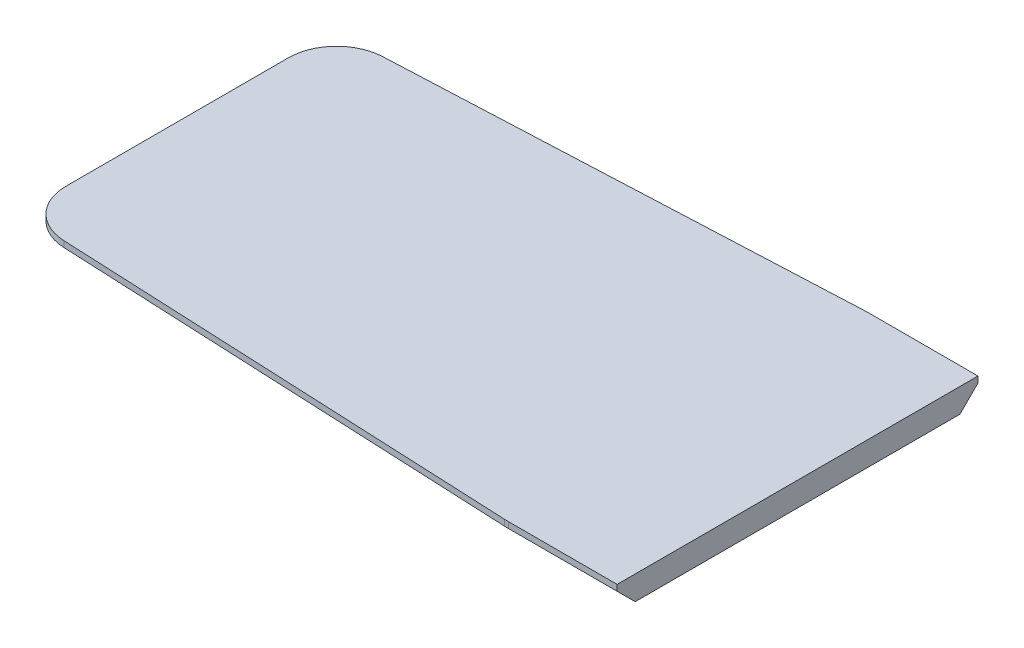
ISO-10303-21;
HEADER;
FILE_DESCRIPTION(('STEP AP214'),'2;1');
FILE_NAME('part.step','',(''),(''),'','','');
FILE_SCHEMA(('AUTOMOTIVE_DESIGN { 1 0 10303 214 1 1 1 1 }'));
ENDSEC;
DATA;
#1=APPLICATION_CONTEXT('core data for automotive mechanical design processes');
#2=APPLICATION_PROTOCOL_DEFINITION('international standard','automotive_design',2000,#1);
#3=PRODUCT_CONTEXT('',#1,'mechanical');
#4=PRODUCT('Part','Part','',(#3));
#5=PRODUCT_RELATED_PRODUCT_CATEGORY('part','',(#4));
#6=PRODUCT_DEFINITION_FORMATION('','',#4);
#7=PRODUCT_DEFINITION_CONTEXT('part definition',#1,'design');
#8=PRODUCT_DEFINITION('design','',#6,#7);
#9=PRODUCT_DEFINITION_SHAPE('','',#8);
#10=(LENGTH_UNIT() NAMED_UNIT(*) SI_UNIT(.MILLI.,.METRE.));
#11=(NAMED_UNIT(*) PLANE_ANGLE_UNIT() SI_UNIT($,.RADIAN.));
#12=(NAMED_UNIT(*) SI_UNIT($,.STERADIAN.) SOLID_ANGLE_UNIT());
#13=UNCERTAINTY_MEASURE_WITH_UNIT(LENGTH_MEASURE(1.E-05),#10,'distance_accuracy_value','');
#14=(GEOMETRIC_REPRESENTATION_CONTEXT(3) GLOBAL_UNCERTAINTY_ASSIGNED_CONTEXT((#13)) GLOBAL_UNIT_ASSIGNED_CONTEXT((#10,
#11,#12)) REPRESENTATION_CONTEXT('',''));
#15=CARTESIAN_POINT('',(0.,0.,0.));
#16=DIRECTION('',(0.,0.,1.));
#17=DIRECTION('',(1.,0.,0.));
#18=AXIS2_PLACEMENT_3D('',#15,#16,#17);
#19=CARTESIAN_POINT('',(45.6038073842628,20.2527928343975,0.));
#20=DIRECTION('',(1.,0.,0.));
#21=DIRECTION('',(0.,0.,-1.));
#22=AXIS2_PLACEMENT_3D('',#19,#20,#21);
#23=PLANE('',#22);
#24=DIRECTION('',(0.,1.,0.));
#25=VECTOR('',#24,1.);
#26=CARTESIAN_POINT('',(45.6038073842628,0.,19.05));
#27=LINE('',#26,#25);
#28=CARTESIAN_POINT('',(45.6038073842628,2.46375527922867,19.05));
#29=VERTEX_POINT('',#28);
#30=CARTESIAN_POINT('',(45.6038073842628,3.09875527922869,19.05));
#31=VERTEX_POINT('',#30);
#32=EDGE_CURVE('E232',#29,#31,#27,.T.);
#33=ORIENTED_EDGE('',*,*,#32,.F.);
#34=DIRECTION('',(0.,0.707106781186547,0.707106781186548));
#35=VECTOR('',#34,1.);
#36=CARTESIAN_POINT('',(45.6038073842628,2.46375527922867,19.05));
#37=LINE('',#36,#35);
#38=CARTESIAN_POINT('',(45.6038073842628,0.558755279228677,17.145));
#39=VERTEX_POINT('',#38);
#40=EDGE_CURVE('E206',#39,#29,#37,.T.);
#41=ORIENTED_EDGE('',*,*,#40,.F.);
#42=DIRECTION('',(0.,0.,-1.));
#43=VECTOR('',#42,1.);
#44=CARTESIAN_POINT('',(45.6038073842628,0.558755279228677,19.05));
#45=LINE('',#44,#43);
#46=CARTESIAN_POINT('',(45.6038073842628,0.558755279228677,-17.145));
#47=VERTEX_POINT('',#46);
#48=EDGE_CURVE('E233',#39,#47,#45,.T.);
#49=ORIENTED_EDGE('',*,*,#48,.T.);
#50=DIRECTION('',(0.,0.707106781186547,-0.707106781186548));
#51=VECTOR('',#50,1.);
#52=CARTESIAN_POINT('',(45.6038073842628,2.46375527922867,-19.05));
#53=LINE('',#52,#51);
#54=CARTESIAN_POINT('',(45.6038073842628,2.46375527922867,-19.05));
#55=VERTEX_POINT('',#54);
#56=EDGE_CURVE('E174',#47,#55,#53,.T.);
#57=ORIENTED_EDGE('',*,*,#56,.T.);
#58=DIRECTION('',(0.,1.,0.));
#59=VECTOR('',#58,1.);
#60=CARTESIAN_POINT('',(45.6038073842628,0.,-19.05));
#61=LINE('',#60,#59);
#62=CARTESIAN_POINT('',(45.6038073842628,3.09875527922869,-19.05));
#63=VERTEX_POINT('',#62);
#64=EDGE_CURVE('E171',#55,#63,#61,.T.);
#65=ORIENTED_EDGE('',*,*,#64,.T.);
#66=DIRECTION('',(0.,0.,1.));
#67=VECTOR('',#66,1.);
#68=CARTESIAN_POINT('',(45.6038073842628,3.09875527922869,0.));
#69=LINE('',#68,#67);
#70=EDGE_CURVE('E11',#63,#31,#69,.T.);
#71=ORIENTED_EDGE('',*,*,#70,.T.);
#72=EDGE_LOOP('',(#33,#41,#49,#57,#65,#71));
#73=FACE_BOUND('',#72,.T.);
#74=ADVANCED_FACE('F36',(#73),#23,.T.);
#75=CARTESIAN_POINT('',(45.6038073842628,3.09875527922869,0.));
#76=DIRECTION('',(0.,1.,0.));
#77=DIRECTION('',(-1.,0.,0.));
#78=AXIS2_PLACEMENT_3D('',#75,#76,#77);
#79=PLANE('',#78);
#80=DIRECTION('',(-1.,0.,0.));
#81=VECTOR('',#80,1.);
#82=CARTESIAN_POINT('',(0.,3.09875527922869,19.05));
#83=LINE('',#82,#81);
#84=CARTESIAN_POINT('',(34.1214030484803,3.09875527922869,19.05));
#85=VERTEX_POINT('',#84);
#86=EDGE_CURVE('E52',#31,#85,#83,.T.);
#87=ORIENTED_EDGE('',*,*,#86,.F.);
#88=ORIENTED_EDGE('',*,*,#70,.F.);
#89=DIRECTION('',(-1.,0.,0.));
#90=VECTOR('',#89,1.);
#91=CARTESIAN_POINT('',(0.,3.09875527922869,-19.05));
#92=LINE('',#91,#90);
#93=CARTESIAN_POINT('',(34.1214030484803,3.09875527922869,-19.05));
#94=VERTEX_POINT('',#93);
#95=EDGE_CURVE('E170',#63,#94,#92,.T.);
#96=ORIENTED_EDGE('',*,*,#95,.T.);
#97=CARTESIAN_POINT('',(34.1214030484803,3.09875527922869,-9.67692292797351));
#98=DIRECTION('',(0.,-1.,0.));
#99=DIRECTION('',(0.,0.,-1.));
#100=AXIS2_PLACEMENT_3D('',#97,#98,#99);
#101=CIRCLE('',#100,9.37307707202649);
#102=CARTESIAN_POINT('',(33.6957935430293,3.09875527922869,-19.0403320478944));
#103=VERTEX_POINT('',#102);
#104=EDGE_CURVE('E150',#103,#94,#101,.T.);
#105=ORIENTED_EDGE('',*,*,#104,.F.);
#106=DIRECTION('',(0.9989685402103,0.,-0.0454076609186504));
#107=VECTOR('',#106,1.);
#108=CARTESIAN_POINT('',(-29.6925031571086,3.09875527922869,-16.1590458342518));
#109=LINE('',#108,#107);
#110=CARTESIAN_POINT('',(-15.0460821307326,3.09875527922869,-16.8247922445416));
#111=VERTEX_POINT('',#110);
#112=EDGE_CURVE('E161',#111,#103,#109,.T.);
#113=ORIENTED_EDGE('',*,*,#112,.F.);
#114=CARTESIAN_POINT('',(-14.8154112132658,3.09875527922869,-11.7500320602733));
#115=DIRECTION('',(0.,1.,0.));
#116=DIRECTION('',(1.,0.,0.));
#117=AXIS2_PLACEMENT_3D('',#114,#115,#116);
#118=CIRCLE('',#117,5.08);
#119=CARTESIAN_POINT('',(-19.8954112132658,3.09875527922869,-11.7500320602733));
#120=VERTEX_POINT('',#119);
#121=EDGE_CURVE('E157',#111,#120,#118,.T.);
#122=ORIENTED_EDGE('',*,*,#121,.T.);
#123=DIRECTION('',(0.,0.,1.));
#124=VECTOR('',#123,1.);
#125=CARTESIAN_POINT('',(-19.8954112132658,3.09875527922868,29.972));
#126=LINE('',#125,#124);
#127=CARTESIAN_POINT('',(-19.8954112132658,3.09875527922869,11.7500320602733));
#128=VERTEX_POINT('',#127);
#129=EDGE_CURVE('E230',#120,#128,#126,.T.);
#130=ORIENTED_EDGE('',*,*,#129,.T.);
#131=CARTESIAN_POINT('',(-14.8154112132658,3.09875527922869,11.7500320602733));
#132=DIRECTION('',(0.,-1.,0.));
#133=DIRECTION('',(1.,0.,0.));
#134=AXIS2_PLACEMENT_3D('',#131,#132,#133);
#135=CIRCLE('',#134,5.08);
#136=CARTESIAN_POINT('',(-15.0460821307326,3.09875527922869,16.8247922445416));
#137=VERTEX_POINT('',#136);
#138=EDGE_CURVE('E60',#137,#128,#135,.T.);
#139=ORIENTED_EDGE('',*,*,#138,.F.);
#140=DIRECTION('',(0.9989685402103,0.,0.0454076609186504));
#141=VECTOR('',#140,1.);
#142=CARTESIAN_POINT('',(-29.6925031571086,3.09875527922869,16.1590458342518));
#143=LINE('',#142,#141);
#144=CARTESIAN_POINT('',(33.6957935430293,3.09875527922869,19.0403320478944));
#145=VERTEX_POINT('',#144);
#146=EDGE_CURVE('E236',#137,#145,#143,.T.);
#147=ORIENTED_EDGE('',*,*,#146,.T.);
#148=CARTESIAN_POINT('',(34.1214030484803,3.09875527922869,9.67692292797351));
#149=DIRECTION('',(0.,1.,0.));
#150=DIRECTION('',(0.,0.,1.));
#151=AXIS2_PLACEMENT_3D('',#148,#149,#150);
#152=CIRCLE('',#151,9.37307707202649);
#153=EDGE_CURVE('E234',#145,#85,#152,.T.);
#154=ORIENTED_EDGE('',*,*,#153,.T.);
#155=EDGE_LOOP('',(#87,#88,#96,#105,#113,#122,#130,#139,#147,#154));
#156=FACE_BOUND('',#155,.T.);
#157=ADVANCED_FACE('F168',(#156),#79,.T.);
#158=CARTESIAN_POINT('',(-17.9904112132658,0.558755279228695,19.05));
#159=DIRECTION('',(0.707106781186548,0.707106781186547,0.));
#160=DIRECTION('',(0.,0.,-1.));
#161=AXIS2_PLACEMENT_3D('',#158,#159,#160);
#162=PLANE('',#161);
#163=DIRECTION('',(0.,0.,1.));
#164=VECTOR('',#163,1.);
#165=CARTESIAN_POINT('',(-19.8954112132658,2.46375527922869,29.972));
#166=LINE('',#165,#164);
#167=CARTESIAN_POINT('',(-19.8954112132658,2.46375527922868,-11.7500320602733));
#168=VERTEX_POINT('',#167);
#169=CARTESIAN_POINT('',(-19.8954112132658,2.46375527922868,11.7500320602733));
#170=VERTEX_POINT('',#169);
#171=EDGE_CURVE('E211',#168,#170,#166,.T.);
#172=ORIENTED_EDGE('',*,*,#171,.F.);
#173=DIRECTION('',(0.707106781186547,-0.707106781186548,0.));
#174=VECTOR('',#173,1.);
#175=CARTESIAN_POINT('',(-19.8954112132658,2.46375527922869,-11.7500320602733));
#176=LINE('',#175,#174);
#177=CARTESIAN_POINT('',(-17.9904112132658,0.558755279228695,-11.7500320602733));
#178=VERTEX_POINT('',#177);
#179=EDGE_CURVE('E282',#168,#178,#176,.T.);
#180=ORIENTED_EDGE('',*,*,#179,.T.);
#181=DIRECTION('',(0.,0.,-1.));
#182=VECTOR('',#181,1.);
#183=CARTESIAN_POINT('',(-17.9904112132658,0.558755279228695,19.05));
#184=LINE('',#183,#182);
#185=CARTESIAN_POINT('',(-17.9904112132658,0.558755279228695,11.7500320602733));
#186=VERTEX_POINT('',#185);
#187=EDGE_CURVE('E213',#186,#178,#184,.T.);
#188=ORIENTED_EDGE('',*,*,#187,.F.);
#189=DIRECTION('',(0.707106781186547,-0.707106781186548,0.));
#190=VECTOR('',#189,1.);
#191=CARTESIAN_POINT('',(-19.8954112132658,2.46375527922869,11.7500320602733));
#192=LINE('',#191,#190);
#193=EDGE_CURVE('E192',#170,#186,#192,.T.);
#194=ORIENTED_EDGE('',*,*,#193,.F.);
#195=EDGE_LOOP('',(#172,#180,#188,#194));
#196=FACE_BOUND('',#195,.T.);
#197=ADVANCED_FACE('F280',(#196),#162,.F.);
#198=CARTESIAN_POINT('',(-29.6925031571086,2.46375527922868,16.1590458342518));
#199=DIRECTION('',(0.0321080649533972,0.707106781186548,-0.706377428974728));
#200=DIRECTION('',(0.9989685402103,0.,0.0454076609186504));
#201=AXIS2_PLACEMENT_3D('',#198,#199,#200);
#202=PLANE('',#201);
#203=DIRECTION('',(0.0321080649533972,-0.707106781186547,-0.706377428974729));
#204=VECTOR('',#203,1.);
#205=CARTESIAN_POINT('',(-15.0460821307326,2.46375527922868,16.8247922445416));
#206=LINE('',#205,#204);
#207=CARTESIAN_POINT('',(-15.0460821307326,2.46375527922868,16.8247922445416));
#208=VERTEX_POINT('',#207);
#209=CARTESIAN_POINT('',(-14.9595805366825,0.558755279228694,14.921757175441));
#210=VERTEX_POINT('',#209);
#211=EDGE_CURVE('E195',#208,#210,#206,.T.);
#212=ORIENTED_EDGE('',*,*,#211,.T.);
#213=DIRECTION('',(-0.9989685402103,0.,-0.0454076609186504));
#214=VECTOR('',#213,1.);
#215=CARTESIAN_POINT('',(0.156416003306425,0.55875527922869,15.6088479272587));
#216=LINE('',#215,#214);
#217=CARTESIAN_POINT('',(33.7822951370793,0.55875527922868,17.1372969787938));
#218=VERTEX_POINT('',#217);
#219=EDGE_CURVE('E220',#218,#210,#216,.T.);
#220=ORIENTED_EDGE('',*,*,#219,.F.);
#221=DIRECTION('',(0.0321080649533966,-0.707106781186546,-0.70637742897473));
#222=VECTOR('',#221,1.);
#223=CARTESIAN_POINT('',(33.6957935430293,2.46375527922867,19.0403320478944));
#224=LINE('',#223,#222);
#225=CARTESIAN_POINT('',(33.6957935430293,2.46375527922867,19.0403320478944));
#226=VERTEX_POINT('',#225);
#227=EDGE_CURVE('E198',#226,#218,#224,.T.);
#228=ORIENTED_EDGE('',*,*,#227,.F.);
#229=DIRECTION('',(0.9989685402103,0.,0.0454076609186504));
#230=VECTOR('',#229,1.);
#231=CARTESIAN_POINT('',(-29.6925031571086,2.46375527922868,16.1590458342518));
#232=LINE('',#231,#230);
#233=EDGE_CURVE('E203',#208,#226,#232,.T.);
#234=ORIENTED_EDGE('',*,*,#233,.F.);
#235=EDGE_LOOP('',(#212,#220,#228,#234));
#236=FACE_BOUND('',#235,.T.);
#237=ADVANCED_FACE('F269',(#236),#202,.F.);
#238=CARTESIAN_POINT('',(34.1214030484803,0.558755279228681,9.67692292797351));
#239=DIRECTION('',(0.,1.,0.));
#240=DIRECTION('',(0.,0.,1.));
#241=AXIS2_PLACEMENT_3D('',#238,#239,#240);
#242=CONICAL_SURFACE('',#241,7.4680770720265,0.785398163397448);
#243=ORIENTED_EDGE('',*,*,#227,.T.);
#244=CARTESIAN_POINT('',(34.1214030484803,0.55875527922868,9.67692292797351));
#245=DIRECTION('',(0.,1.,0.));
#246=DIRECTION('',(-1.,0.,0.));
#247=AXIS2_PLACEMENT_3D('',#244,#245,#246);
#248=CIRCLE('',#247,7.4680770720265);
#249=CARTESIAN_POINT('',(34.1214030484803,0.55875527922868,17.145));
#250=VERTEX_POINT('',#249);
#251=EDGE_CURVE('E218',#250,#218,#248,.F.);
#252=ORIENTED_EDGE('',*,*,#251,.F.);
#253=DIRECTION('',(0.,-0.707106781186548,-0.707106781186547));
#254=VECTOR('',#253,1.);
#255=CARTESIAN_POINT('',(34.1214030484803,2.46375527922867,19.05));
#256=LINE('',#255,#254);
#257=CARTESIAN_POINT('',(34.1214030484803,2.46375527922867,19.05));
#258=VERTEX_POINT('',#257);
#259=EDGE_CURVE('E45',#258,#250,#256,.T.);
#260=ORIENTED_EDGE('',*,*,#259,.F.);
#261=CARTESIAN_POINT('',(34.1214030484803,2.46375527922867,9.67692292797351));
#262=DIRECTION('',(0.,1.,0.));
#263=DIRECTION('',(0.,0.,1.));
#264=AXIS2_PLACEMENT_3D('',#261,#262,#263);
#265=CIRCLE('',#264,9.37307707202649);
#266=EDGE_CURVE('E205',#226,#258,#265,.T.);
#267=ORIENTED_EDGE('',*,*,#266,.F.);
#268=EDGE_LOOP('',(#243,#252,#260,#267));
#269=FACE_BOUND('',#268,.T.);
#270=ADVANCED_FACE('F262',(#269),#242,.T.);
#271=CARTESIAN_POINT('',(0.,0.,19.05));
#272=DIRECTION('',(0.,0.,1.));
#273=DIRECTION('',(1.,0.,0.));
#274=AXIS2_PLACEMENT_3D('',#271,#272,#273);
#275=PLANE('',#274);
#276=DIRECTION('',(1.,0.,0.));
#277=VECTOR('',#276,1.);
#278=CARTESIAN_POINT('',(48.1438073842628,2.46375527922867,19.05));
#279=LINE('',#278,#277);
#280=EDGE_CURVE('E208',#258,#29,#279,.T.);
#281=ORIENTED_EDGE('',*,*,#280,.T.);
#282=ORIENTED_EDGE('',*,*,#32,.T.);
#283=ORIENTED_EDGE('',*,*,#86,.T.);
#284=DIRECTION('',(0.,1.,0.));
#285=VECTOR('',#284,1.);
#286=CARTESIAN_POINT('',(34.1214030484803,-9.9706328408659,19.05));
#287=LINE('',#286,#285);
#288=EDGE_CURVE('E239',#258,#85,#287,.T.);
#289=ORIENTED_EDGE('',*,*,#288,.F.);
#290=EDGE_LOOP('',(#281,#282,#283,#289));
#291=FACE_BOUND('',#290,.T.);
#292=ADVANCED_FACE('F255',(#291),#275,.T.);
#293=CARTESIAN_POINT('',(0.,0.55875527922869,19.05));
#294=DIRECTION('',(0.,1.,0.));
#295=DIRECTION('',(-1.,0.,0.));
#296=AXIS2_PLACEMENT_3D('',#293,#294,#295);
#297=PLANE('',#296);
#298=ORIENTED_EDGE('',*,*,#48,.F.);
#299=DIRECTION('',(-1.,0.,0.));
#300=VECTOR('',#299,1.);
#301=CARTESIAN_POINT('',(34.1214030484803,0.55875527922868,17.145));
#302=LINE('',#301,#300);
#303=EDGE_CURVE('E217',#39,#250,#302,.T.);
#304=ORIENTED_EDGE('',*,*,#303,.T.);
#305=ORIENTED_EDGE('',*,*,#251,.T.);
#306=ORIENTED_EDGE('',*,*,#219,.T.);
#307=CARTESIAN_POINT('',(-14.8154112132658,0.558755279228694,11.7500320602733));
#308=DIRECTION('',(0.,1.,0.));
#309=DIRECTION('',(-1.,0.,0.));
#310=AXIS2_PLACEMENT_3D('',#307,#308,#309);
#311=CIRCLE('',#310,3.17500000000001);
#312=EDGE_CURVE('E215',#210,#186,#311,.F.);
#313=ORIENTED_EDGE('',*,*,#312,.T.);
#314=ORIENTED_EDGE('',*,*,#187,.T.);
#315=CARTESIAN_POINT('',(-14.8154112132658,0.558755279228694,-11.7500320602733));
#316=DIRECTION('',(0.,-1.,0.));
#317=DIRECTION('',(-1.,0.,0.));
#318=AXIS2_PLACEMENT_3D('',#315,#316,#317);
#319=CIRCLE('',#318,3.17500000000001);
#320=CARTESIAN_POINT('',(-14.9595805366825,0.558755279228694,-14.921757175441));
#321=VERTEX_POINT('',#320);
#322=EDGE_CURVE('E185',#321,#178,#319,.F.);
#323=ORIENTED_EDGE('',*,*,#322,.F.);
#324=DIRECTION('',(-0.9989685402103,0.,0.0454076609186504));
#325=VECTOR('',#324,1.);
#326=CARTESIAN_POINT('',(0.156416003306425,0.55875527922869,-15.6088479272587));
#327=LINE('',#326,#325);
#328=CARTESIAN_POINT('',(33.7822951370793,0.55875527922868,-17.1372969787938));
#329=VERTEX_POINT('',#328);
#330=EDGE_CURVE('E301',#329,#321,#327,.T.);
#331=ORIENTED_EDGE('',*,*,#330,.F.);
#332=CARTESIAN_POINT('',(34.1214030484803,0.55875527922868,-9.67692292797351));
#333=DIRECTION('',(0.,-1.,0.));
#334=DIRECTION('',(-1.,0.,0.));
#335=AXIS2_PLACEMENT_3D('',#332,#333,#334);
#336=CIRCLE('',#335,7.4680770720265);
#337=CARTESIAN_POINT('',(34.1214030484803,0.55875527922868,-17.145));
#338=VERTEX_POINT('',#337);
#339=EDGE_CURVE('E184',#338,#329,#336,.F.);
#340=ORIENTED_EDGE('',*,*,#339,.F.);
#341=DIRECTION('',(-1.,0.,0.));
#342=VECTOR('',#341,1.);
#343=CARTESIAN_POINT('',(34.1214030484803,0.55875527922868,-17.145));
#344=LINE('',#343,#342);
#345=EDGE_CURVE('E182',#47,#338,#344,.T.);
#346=ORIENTED_EDGE('',*,*,#345,.F.);
#347=EDGE_LOOP('',(#298,#304,#305,#306,#313,#314,#323,#331,#340,#346));
#348=FACE_BOUND('',#347,.T.);
#349=ADVANCED_FACE('F266',(#348),#297,.F.);
#350=CARTESIAN_POINT('',(0.,2.46375527922868,19.05));
#351=DIRECTION('',(0.,-0.707106781186548,0.707106781186547));
#352=DIRECTION('',(-1.,0.,0.));
#353=AXIS2_PLACEMENT_3D('',#350,#351,#352);
#354=PLANE('',#353);
#355=ORIENTED_EDGE('',*,*,#303,.F.);
#356=ORIENTED_EDGE('',*,*,#40,.T.);
#357=ORIENTED_EDGE('',*,*,#280,.F.);
#358=ORIENTED_EDGE('',*,*,#259,.T.);
#359=EDGE_LOOP('',(#355,#356,#357,#358));
#360=FACE_BOUND('',#359,.T.);
#361=ADVANCED_FACE('F38',(#360),#354,.T.);
#362=CARTESIAN_POINT('',(-29.6925031571086,28.6087552792287,16.1590458342518));
#363=DIRECTION('',(0.0454076609186504,0.,-0.9989685402103));
#364=DIRECTION('',(-0.9989685402103,0.,-0.0454076609186504));
#365=AXIS2_PLACEMENT_3D('',#362,#363,#364);
#366=PLANE('',#365);
#367=DIRECTION('',(0.,-1.,0.));
#368=VECTOR('',#367,1.);
#369=CARTESIAN_POINT('',(-15.0460821307325,28.6087552792287,16.8247922445416));
#370=LINE('',#369,#368);
#371=EDGE_CURVE('E225',#137,#208,#370,.T.);
#372=ORIENTED_EDGE('',*,*,#371,.T.);
#373=ORIENTED_EDGE('',*,*,#233,.T.);
#374=DIRECTION('',(0.,1.,0.));
#375=VECTOR('',#374,1.);
#376=CARTESIAN_POINT('',(33.6957935430293,-9.9706328408659,19.0403320478944));
#377=LINE('',#376,#375);
#378=EDGE_CURVE('E229',#226,#145,#377,.T.);
#379=ORIENTED_EDGE('',*,*,#378,.T.);
#380=ORIENTED_EDGE('',*,*,#146,.F.);
#381=EDGE_LOOP('',(#372,#373,#379,#380));
#382=FACE_BOUND('',#381,.T.);
#383=ADVANCED_FACE('F347',(#382),#366,.F.);
#384=CARTESIAN_POINT('',(-14.8154112132658,0.558755279228693,11.7500320602733));
#385=DIRECTION('',(0.,1.,0.));
#386=DIRECTION('',(0.,0.,1.));
#387=AXIS2_PLACEMENT_3D('',#384,#385,#386);
#388=CONICAL_SURFACE('',#387,3.17500000000001,0.785398163397449);
#389=ORIENTED_EDGE('',*,*,#193,.T.);
#390=ORIENTED_EDGE('',*,*,#312,.F.);
#391=ORIENTED_EDGE('',*,*,#211,.F.);
#392=CARTESIAN_POINT('',(-14.8154112132658,2.46375527922868,11.7500320602733));
#393=DIRECTION('',(0.,1.,0.));
#394=DIRECTION('',(0.,0.,1.));
#395=AXIS2_PLACEMENT_3D('',#392,#393,#394);
#396=CIRCLE('',#395,5.08);
#397=EDGE_CURVE('E209',#170,#208,#396,.T.);
#398=ORIENTED_EDGE('',*,*,#397,.F.);
#399=EDGE_LOOP('',(#389,#390,#391,#398));
#400=FACE_BOUND('',#399,.T.);
#401=ADVANCED_FACE('F274',(#400),#388,.T.);
#402=CARTESIAN_POINT('',(-19.8954112132658,26.6529253978415,29.972));
#403=DIRECTION('',(1.,0.,0.));
#404=DIRECTION('',(0.,1.,0.));
#405=AXIS2_PLACEMENT_3D('',#402,#403,#404);
#406=PLANE('',#405);
#407=ORIENTED_EDGE('',*,*,#129,.F.);
#408=DIRECTION('',(0.,-1.,0.));
#409=VECTOR('',#408,1.);
#410=CARTESIAN_POINT('',(-19.8954112132658,26.6529253978415,-11.7500320602733));
#411=LINE('',#410,#409);
#412=EDGE_CURVE('E304',#168,#120,#411,.F.);
#413=ORIENTED_EDGE('',*,*,#412,.F.);
#414=ORIENTED_EDGE('',*,*,#171,.T.);
#415=DIRECTION('',(0.,-1.,0.));
#416=VECTOR('',#415,1.);
#417=CARTESIAN_POINT('',(-19.8954112132658,26.6529253978415,11.7500320602733));
#418=LINE('',#417,#416);
#419=EDGE_CURVE('E222',#170,#128,#418,.F.);
#420=ORIENTED_EDGE('',*,*,#419,.T.);
#421=EDGE_LOOP('',(#407,#413,#414,#420));
#422=FACE_BOUND('',#421,.T.);
#423=ADVANCED_FACE('F346',(#422),#406,.F.);
#424=CARTESIAN_POINT('',(-14.8154112132658,28.6087552792287,11.7500320602733));
#425=DIRECTION('',(0.,-1.,0.));
#426=DIRECTION('',(1.,0.,0.));
#427=AXIS2_PLACEMENT_3D('',#424,#425,#426);
#428=CYLINDRICAL_SURFACE('',#427,5.08);
#429=ORIENTED_EDGE('',*,*,#419,.F.);
#430=ORIENTED_EDGE('',*,*,#397,.T.);
#431=ORIENTED_EDGE('',*,*,#371,.F.);
#432=ORIENTED_EDGE('',*,*,#138,.T.);
#433=EDGE_LOOP('',(#429,#430,#431,#432));
#434=FACE_BOUND('',#433,.T.);
#435=ADVANCED_FACE('F351',(#434),#428,.T.);
#436=CARTESIAN_POINT('',(34.1214030484803,-9.9706328408659,9.67692292797351));
#437=DIRECTION('',(0.,1.,0.));
#438=DIRECTION('',(0.,0.,1.));
#439=AXIS2_PLACEMENT_3D('',#436,#437,#438);
#440=CYLINDRICAL_SURFACE('',#439,9.37307707202649);
#441=ORIENTED_EDGE('',*,*,#378,.F.);
#442=ORIENTED_EDGE('',*,*,#266,.T.);
#443=ORIENTED_EDGE('',*,*,#288,.T.);
#444=ORIENTED_EDGE('',*,*,#153,.F.);
#445=EDGE_LOOP('',(#441,#442,#443,#444));
#446=FACE_BOUND('',#445,.T.);
#447=ADVANCED_FACE('F343',(#446),#440,.T.);
#448=CARTESIAN_POINT('',(-29.6925031571086,2.46375527922868,-16.1590458342518));
#449=DIRECTION('',(0.0321080649533972,0.707106781186548,0.706377428974728));
#450=DIRECTION('',(0.9989685402103,0.,-0.0454076609186504));
#451=AXIS2_PLACEMENT_3D('',#448,#449,#450);
#452=PLANE('',#451);
#453=DIRECTION('',(0.0321080649533972,-0.707106781186547,0.706377428974729));
#454=VECTOR('',#453,1.);
#455=CARTESIAN_POINT('',(-15.0460821307326,2.46375527922868,-16.8247922445416));
#456=LINE('',#455,#454);
#457=CARTESIAN_POINT('',(-15.0460821307326,2.46375527922868,-16.8247922445416));
#458=VERTEX_POINT('',#457);
#459=EDGE_CURVE('E285',#458,#321,#456,.T.);
#460=ORIENTED_EDGE('',*,*,#459,.F.);
#461=DIRECTION('',(0.9989685402103,0.,-0.0454076609186504));
#462=VECTOR('',#461,1.);
#463=CARTESIAN_POINT('',(-29.6925031571086,2.46375527922868,-16.1590458342518));
#464=LINE('',#463,#462);
#465=CARTESIAN_POINT('',(33.6957935430293,2.46375527922867,-19.0403320478944));
#466=VERTEX_POINT('',#465);
#467=EDGE_CURVE('E191',#458,#466,#464,.T.);
#468=ORIENTED_EDGE('',*,*,#467,.T.);
#469=DIRECTION('',(0.0321080649533966,-0.707106781186546,0.70637742897473));
#470=VECTOR('',#469,1.);
#471=CARTESIAN_POINT('',(33.6957935430293,2.46375527922867,-19.0403320478944));
#472=LINE('',#471,#470);
#473=EDGE_CURVE('E288',#466,#329,#472,.T.);
#474=ORIENTED_EDGE('',*,*,#473,.T.);
#475=ORIENTED_EDGE('',*,*,#330,.T.);
#476=EDGE_LOOP('',(#460,#468,#474,#475));
#477=FACE_BOUND('',#476,.T.);
#478=ADVANCED_FACE('F311',(#477),#452,.F.);
#479=CARTESIAN_POINT('',(34.1214030484803,0.558755279228681,-9.67692292797351));
#480=DIRECTION('',(0.,1.,0.));
#481=DIRECTION('',(0.,0.,-1.));
#482=AXIS2_PLACEMENT_3D('',#479,#480,#481);
#483=CONICAL_SURFACE('',#482,7.4680770720265,0.785398163397448);
#484=ORIENTED_EDGE('',*,*,#473,.F.);
#485=CARTESIAN_POINT('',(34.1214030484803,2.46375527922867,-9.67692292797351));
#486=DIRECTION('',(0.,-1.,0.));
#487=DIRECTION('',(0.,0.,-1.));
#488=AXIS2_PLACEMENT_3D('',#485,#486,#487);
#489=CIRCLE('',#488,9.37307707202649);
#490=CARTESIAN_POINT('',(34.1214030484803,2.46375527922867,-19.05));
#491=VERTEX_POINT('',#490);
#492=EDGE_CURVE('E153',#466,#491,#489,.T.);
#493=ORIENTED_EDGE('',*,*,#492,.T.);
#494=DIRECTION('',(0.,-0.707106781186548,0.707106781186547));
#495=VECTOR('',#494,1.);
#496=CARTESIAN_POINT('',(34.1214030484803,2.46375527922867,-19.05));
#497=LINE('',#496,#495);
#498=EDGE_CURVE('E238',#491,#338,#497,.T.);
#499=ORIENTED_EDGE('',*,*,#498,.T.);
#500=ORIENTED_EDGE('',*,*,#339,.T.);
#501=EDGE_LOOP('',(#484,#493,#499,#500));
#502=FACE_BOUND('',#501,.T.);
#503=ADVANCED_FACE('F317',(#502),#483,.T.);
#504=CARTESIAN_POINT('',(0.,0.,-19.05));
#505=DIRECTION('',(0.,0.,-1.));
#506=DIRECTION('',(1.,0.,0.));
#507=AXIS2_PLACEMENT_3D('',#504,#505,#506);
#508=PLANE('',#507);
#509=DIRECTION('',(1.,0.,0.));
#510=VECTOR('',#509,1.);
#511=CARTESIAN_POINT('',(48.1438073842628,2.46375527922867,-19.05));
#512=LINE('',#511,#510);
#513=EDGE_CURVE('E186',#491,#55,#512,.T.);
#514=ORIENTED_EDGE('',*,*,#513,.F.);
#515=DIRECTION('',(0.,1.,0.));
#516=VECTOR('',#515,1.);
#517=CARTESIAN_POINT('',(34.1214030484803,-9.9706328408659,-19.05));
#518=LINE('',#517,#516);
#519=EDGE_CURVE('E158',#491,#94,#518,.T.);
#520=ORIENTED_EDGE('',*,*,#519,.T.);
#521=ORIENTED_EDGE('',*,*,#95,.F.);
#522=ORIENTED_EDGE('',*,*,#64,.F.);
#523=EDGE_LOOP('',(#514,#520,#521,#522));
#524=FACE_BOUND('',#523,.T.);
#525=ADVANCED_FACE('F325',(#524),#508,.T.);
#526=CARTESIAN_POINT('',(0.,2.46375527922868,-19.05));
#527=DIRECTION('',(0.,-0.707106781186548,-0.707106781186547));
#528=DIRECTION('',(-1.,0.,0.));
#529=AXIS2_PLACEMENT_3D('',#526,#527,#528);
#530=PLANE('',#529);
#531=ORIENTED_EDGE('',*,*,#345,.T.);
#532=ORIENTED_EDGE('',*,*,#498,.F.);
#533=ORIENTED_EDGE('',*,*,#513,.T.);
#534=ORIENTED_EDGE('',*,*,#56,.F.);
#535=EDGE_LOOP('',(#531,#532,#533,#534));
#536=FACE_BOUND('',#535,.T.);
#537=ADVANCED_FACE('F320',(#536),#530,.T.);
#538=CARTESIAN_POINT('',(-29.6925031571086,28.6087552792287,-16.1590458342518));
#539=DIRECTION('',(0.0454076609186504,0.,0.9989685402103));
#540=DIRECTION('',(-0.9989685402103,0.,0.0454076609186504));
#541=AXIS2_PLACEMENT_3D('',#538,#539,#540);
#542=PLANE('',#541);
#543=DIRECTION('',(0.,-1.,0.));
#544=VECTOR('',#543,1.);
#545=CARTESIAN_POINT('',(-15.0460821307325,28.6087552792287,-16.8247922445416));
#546=LINE('',#545,#544);
#547=EDGE_CURVE('E164',#111,#458,#546,.T.);
#548=ORIENTED_EDGE('',*,*,#547,.F.);
#549=ORIENTED_EDGE('',*,*,#112,.T.);
#550=DIRECTION('',(0.,1.,0.));
#551=VECTOR('',#550,1.);
#552=CARTESIAN_POINT('',(33.6957935430293,-9.9706328408659,-19.0403320478944));
#553=LINE('',#552,#551);
#554=EDGE_CURVE('E146',#466,#103,#553,.T.);
#555=ORIENTED_EDGE('',*,*,#554,.F.);
#556=ORIENTED_EDGE('',*,*,#467,.F.);
#557=EDGE_LOOP('',(#548,#549,#555,#556));
#558=FACE_BOUND('',#557,.T.);
#559=ADVANCED_FACE('F162',(#558),#542,.F.);
#560=CARTESIAN_POINT('',(-14.8154112132658,0.558755279228693,-11.7500320602733));
#561=DIRECTION('',(0.,1.,0.));
#562=DIRECTION('',(0.,0.,-1.));
#563=AXIS2_PLACEMENT_3D('',#560,#561,#562);
#564=CONICAL_SURFACE('',#563,3.17500000000001,0.785398163397449);
#565=ORIENTED_EDGE('',*,*,#179,.F.);
#566=CARTESIAN_POINT('',(-14.8154112132658,2.46375527922868,-11.7500320602733));
#567=DIRECTION('',(0.,-1.,0.));
#568=DIRECTION('',(0.,0.,-1.));
#569=AXIS2_PLACEMENT_3D('',#566,#567,#568);
#570=CIRCLE('',#569,5.08);
#571=EDGE_CURVE('E187',#168,#458,#570,.T.);
#572=ORIENTED_EDGE('',*,*,#571,.T.);
#573=ORIENTED_EDGE('',*,*,#459,.T.);
#574=ORIENTED_EDGE('',*,*,#322,.T.);
#575=EDGE_LOOP('',(#565,#572,#573,#574));
#576=FACE_BOUND('',#575,.T.);
#577=ADVANCED_FACE('F313',(#576),#564,.T.);
#578=CARTESIAN_POINT('',(-14.8154112132658,28.6087552792287,-11.7500320602733));
#579=DIRECTION('',(0.,-1.,0.));
#580=DIRECTION('',(1.,0.,0.));
#581=AXIS2_PLACEMENT_3D('',#578,#579,#580);
#582=CYLINDRICAL_SURFACE('',#581,5.08);
#583=ORIENTED_EDGE('',*,*,#412,.T.);
#584=ORIENTED_EDGE('',*,*,#121,.F.);
#585=ORIENTED_EDGE('',*,*,#547,.T.);
#586=ORIENTED_EDGE('',*,*,#571,.F.);
#587=EDGE_LOOP('',(#583,#584,#585,#586));
#588=FACE_BOUND('',#587,.T.);
#589=ADVANCED_FACE('F308',(#588),#582,.T.);
#590=CARTESIAN_POINT('',(34.1214030484803,-9.9706328408659,-9.67692292797351));
#591=DIRECTION('',(0.,1.,0.));
#592=DIRECTION('',(0.,0.,-1.));
#593=AXIS2_PLACEMENT_3D('',#590,#591,#592);
#594=CYLINDRICAL_SURFACE('',#593,9.37307707202649);
#595=ORIENTED_EDGE('',*,*,#554,.T.);
#596=ORIENTED_EDGE('',*,*,#104,.T.);
#597=ORIENTED_EDGE('',*,*,#519,.F.);
#598=ORIENTED_EDGE('',*,*,#492,.F.);
#599=EDGE_LOOP('',(#595,#596,#597,#598));
#600=FACE_BOUND('',#599,.T.);
#601=ADVANCED_FACE('F148',(#600),#594,.T.);
#602=CLOSED_SHELL('',(#74,#157,#197,#237,#270,#292,#349,#361,#383,#401,#423,#435,#447,#478,#503,
#525,#537,#559,#577,#589,#601));
#603=MANIFOLD_SOLID_BREP('B2',#602);
#604=ADVANCED_BREP_SHAPE_REPRESENTATION('',(#18,#603),#14);
#605=SHAPE_DEFINITION_REPRESENTATION(#9,#604);
ENDSEC;
END-ISO-10303-21;
